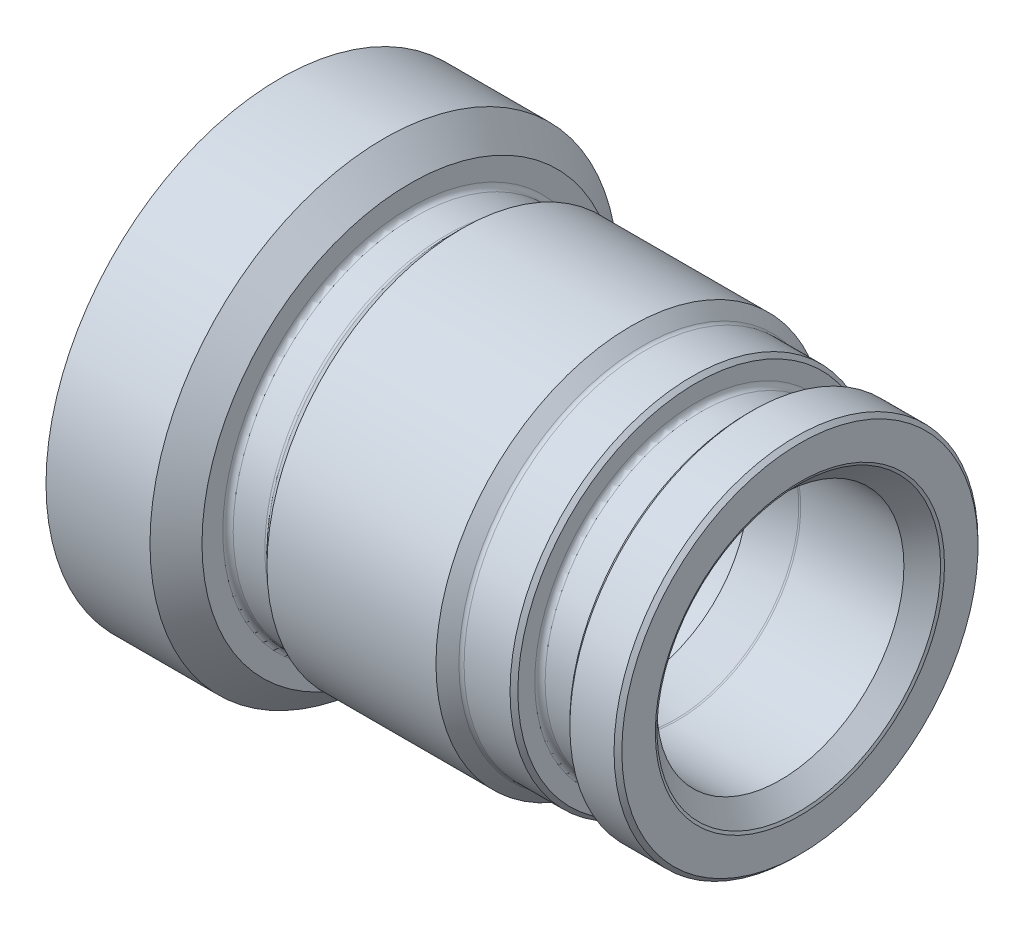
ISO-10303-21;
HEADER;
FILE_DESCRIPTION(('STEP AP214'),'2;1');
FILE_NAME('part.step','',(''),(''),'','','');
FILE_SCHEMA(('AUTOMOTIVE_DESIGN { 1 0 10303 214 1 1 1 1 }'));
ENDSEC;
DATA;
#1=APPLICATION_CONTEXT('core data for automotive mechanical design processes');
#2=APPLICATION_PROTOCOL_DEFINITION('international standard','automotive_design',2000,#1);
#3=PRODUCT_CONTEXT('',#1,'mechanical');
#4=PRODUCT('Part','Part','',(#3));
#5=PRODUCT_RELATED_PRODUCT_CATEGORY('part','',(#4));
#6=PRODUCT_DEFINITION_FORMATION('','',#4);
#7=PRODUCT_DEFINITION_CONTEXT('part definition',#1,'design');
#8=PRODUCT_DEFINITION('design','',#6,#7);
#9=PRODUCT_DEFINITION_SHAPE('','',#8);
#10=(LENGTH_UNIT() NAMED_UNIT(*) SI_UNIT(.MILLI.,.METRE.));
#11=(NAMED_UNIT(*) PLANE_ANGLE_UNIT() SI_UNIT($,.RADIAN.));
#12=(NAMED_UNIT(*) SI_UNIT($,.STERADIAN.) SOLID_ANGLE_UNIT());
#13=UNCERTAINTY_MEASURE_WITH_UNIT(LENGTH_MEASURE(1.E-05),#10,'distance_accuracy_value','');
#14=(GEOMETRIC_REPRESENTATION_CONTEXT(3) GLOBAL_UNCERTAINTY_ASSIGNED_CONTEXT((#13)) GLOBAL_UNIT_ASSIGNED_CONTEXT((#10,
#11,#12)) REPRESENTATION_CONTEXT('',''));
#15=CARTESIAN_POINT('',(0.,0.,0.));
#16=DIRECTION('',(0.,0.,1.));
#17=DIRECTION('',(1.,0.,0.));
#18=AXIS2_PLACEMENT_3D('',#15,#16,#17);
#19=CARTESIAN_POINT('',(-37.5919999999999,0.,0.));
#20=DIRECTION('',(-1.,0.,0.));
#21=DIRECTION('',(0.,0.,1.));
#22=AXIS2_PLACEMENT_3D('',#19,#20,#21);
#23=TOROIDAL_SURFACE('',#22,18.288,0.508000000000002);
#24=CARTESIAN_POINT('',(-37.5919999999999,0.,0.));
#25=DIRECTION('',(-1.,0.,0.));
#26=DIRECTION('',(0.,0.,1.));
#27=AXIS2_PLACEMENT_3D('',#24,#25,#26);
#28=CIRCLE('',#27,17.78);
#29=CARTESIAN_POINT('',(-37.5919999999999,0.,17.78));
#30=VERTEX_POINT('',#29);
#31=EDGE_CURVE('E149',#30,#30,#28,.T.);
#32=ORIENTED_EDGE('',*,*,#31,.T.);
#33=EDGE_LOOP('',(#32));
#34=FACE_BOUND('',#33,.T.);
#35=CARTESIAN_POINT('',(-38.0999999999999,0.,0.));
#36=DIRECTION('',(-1.,0.,0.));
#37=DIRECTION('',(0.,0.,1.));
#38=AXIS2_PLACEMENT_3D('',#35,#36,#37);
#39=CIRCLE('',#38,18.288);
#40=CARTESIAN_POINT('',(-38.0999999999999,0.,18.288));
#41=VERTEX_POINT('',#40);
#42=EDGE_CURVE('E65',#41,#41,#39,.T.);
#43=ORIENTED_EDGE('',*,*,#42,.F.);
#44=EDGE_LOOP('',(#43));
#45=FACE_BOUND('',#44,.T.);
#46=ADVANCED_FACE('F34',(#34,#45),#23,.F.);
#47=CARTESIAN_POINT('',(-38.0999999999999,18.288,0.));
#48=DIRECTION('',(-1.,0.,0.));
#49=DIRECTION('',(0.,0.,1.));
#50=AXIS2_PLACEMENT_3D('',#47,#48,#49);
#51=PLANE('',#50);
#52=CARTESIAN_POINT('',(-38.0999999999999,0.,0.));
#53=DIRECTION('',(-1.,0.,0.));
#54=DIRECTION('',(0.,0.,1.));
#55=AXIS2_PLACEMENT_3D('',#52,#53,#54);
#56=CIRCLE('',#55,20.32);
#57=CARTESIAN_POINT('',(-38.0999999999999,0.,20.32));
#58=VERTEX_POINT('',#57);
#59=EDGE_CURVE('E68',#58,#58,#56,.T.);
#60=ORIENTED_EDGE('',*,*,#59,.F.);
#61=EDGE_LOOP('',(#60));
#62=FACE_BOUND('',#61,.T.);
#63=ORIENTED_EDGE('',*,*,#42,.T.);
#64=EDGE_LOOP('',(#63));
#65=FACE_BOUND('',#64,.T.);
#66=ADVANCED_FACE('F174',(#62,#65),#51,.F.);
#67=CARTESIAN_POINT('',(-38.0999999999999,0.,0.));
#68=DIRECTION('',(-1.,0.,0.));
#69=DIRECTION('',(0.,0.,1.));
#70=AXIS2_PLACEMENT_3D('',#67,#68,#69);
#71=CONICAL_SURFACE('',#70,20.32,0.785398163397449);
#72=CARTESIAN_POINT('',(-40.6399999999999,0.,0.));
#73=DIRECTION('',(-1.,0.,0.));
#74=DIRECTION('',(0.,0.,1.));
#75=AXIS2_PLACEMENT_3D('',#72,#73,#74);
#76=CIRCLE('',#75,22.86);
#77=CARTESIAN_POINT('',(-40.6399999999999,0.,22.86));
#78=VERTEX_POINT('',#77);
#79=EDGE_CURVE('E71',#78,#78,#76,.T.);
#80=ORIENTED_EDGE('',*,*,#79,.F.);
#81=EDGE_LOOP('',(#80));
#82=FACE_BOUND('',#81,.T.);
#83=ORIENTED_EDGE('',*,*,#59,.T.);
#84=EDGE_LOOP('',(#83));
#85=FACE_BOUND('',#84,.T.);
#86=ADVANCED_FACE('F178',(#82,#85),#71,.T.);
#87=CARTESIAN_POINT('',(0.,0.,0.));
#88=DIRECTION('',(-1.,0.,0.));
#89=DIRECTION('',(0.,0.,1.));
#90=AXIS2_PLACEMENT_3D('',#87,#88,#89);
#91=CYLINDRICAL_SURFACE('',#90,22.86);
#92=CARTESIAN_POINT('',(-50.7999999999999,0.,0.));
#93=DIRECTION('',(-1.,0.,0.));
#94=DIRECTION('',(0.,0.,1.));
#95=AXIS2_PLACEMENT_3D('',#92,#93,#94);
#96=CIRCLE('',#95,22.86);
#97=CARTESIAN_POINT('',(-50.7999999999999,0.,22.86));
#98=VERTEX_POINT('',#97);
#99=EDGE_CURVE('E74',#98,#98,#96,.T.);
#100=ORIENTED_EDGE('',*,*,#99,.F.);
#101=EDGE_LOOP('',(#100));
#102=FACE_BOUND('',#101,.T.);
#103=ORIENTED_EDGE('',*,*,#79,.T.);
#104=EDGE_LOOP('',(#103));
#105=FACE_BOUND('',#104,.T.);
#106=ADVANCED_FACE('F183',(#102,#105),#91,.T.);
#107=CARTESIAN_POINT('',(-50.7999999999999,22.86,0.));
#108=DIRECTION('',(1.,0.,0.));
#109=DIRECTION('',(0.,0.,-1.));
#110=AXIS2_PLACEMENT_3D('',#107,#108,#109);
#111=PLANE('',#110);
#112=CARTESIAN_POINT('',(-50.7999999999999,0.,0.));
#113=DIRECTION('',(-1.,0.,0.));
#114=DIRECTION('',(0.,0.,1.));
#115=AXIS2_PLACEMENT_3D('',#112,#113,#114);
#116=CIRCLE('',#115,7.62);
#117=CARTESIAN_POINT('',(-50.7999999999999,0.,7.62));
#118=VERTEX_POINT('',#117);
#119=EDGE_CURVE('E77',#118,#118,#116,.T.);
#120=ORIENTED_EDGE('',*,*,#119,.F.);
#121=EDGE_LOOP('',(#120));
#122=FACE_BOUND('',#121,.T.);
#123=ORIENTED_EDGE('',*,*,#99,.T.);
#124=EDGE_LOOP('',(#123));
#125=FACE_BOUND('',#124,.T.);
#126=ADVANCED_FACE('F191',(#122,#125),#111,.F.);
#127=CARTESIAN_POINT('',(0.,0.,0.));
#128=DIRECTION('',(-1.,0.,0.));
#129=DIRECTION('',(0.,0.,1.));
#130=AXIS2_PLACEMENT_3D('',#127,#128,#129);
#131=CYLINDRICAL_SURFACE('',#130,7.62);
#132=CARTESIAN_POINT('',(-48.2599999999999,0.,0.));
#133=DIRECTION('',(-1.,0.,0.));
#134=DIRECTION('',(0.,0.,1.));
#135=AXIS2_PLACEMENT_3D('',#132,#133,#134);
#136=CIRCLE('',#135,7.62);
#137=CARTESIAN_POINT('',(-48.2599999999999,0.,7.62));
#138=VERTEX_POINT('',#137);
#139=EDGE_CURVE('E80',#138,#138,#136,.T.);
#140=ORIENTED_EDGE('',*,*,#139,.F.);
#141=EDGE_LOOP('',(#140));
#142=FACE_BOUND('',#141,.T.);
#143=ORIENTED_EDGE('',*,*,#119,.T.);
#144=EDGE_LOOP('',(#143));
#145=FACE_BOUND('',#144,.T.);
#146=ADVANCED_FACE('F195',(#142,#145),#131,.F.);
#147=CARTESIAN_POINT('',(-48.2599999999999,7.62,0.));
#148=DIRECTION('',(-1.,0.,0.));
#149=DIRECTION('',(0.,0.,1.));
#150=AXIS2_PLACEMENT_3D('',#147,#148,#149);
#151=PLANE('',#150);
#152=CARTESIAN_POINT('',(-48.2599999999999,0.,0.));
#153=DIRECTION('',(-1.,0.,0.));
#154=DIRECTION('',(0.,0.,1.));
#155=AXIS2_PLACEMENT_3D('',#152,#153,#154);
#156=CIRCLE('',#155,9.65199999999998);
#157=CARTESIAN_POINT('',(-48.2599999999999,0.,9.65199999999998));
#158=VERTEX_POINT('',#157);
#159=EDGE_CURVE('E83',#158,#158,#156,.T.);
#160=ORIENTED_EDGE('',*,*,#159,.F.);
#161=EDGE_LOOP('',(#160));
#162=FACE_BOUND('',#161,.T.);
#163=ORIENTED_EDGE('',*,*,#139,.T.);
#164=EDGE_LOOP('',(#163));
#165=FACE_BOUND('',#164,.T.);
#166=ADVANCED_FACE('F199',(#162,#165),#151,.F.);
#167=CARTESIAN_POINT('',(-47.7519999999999,0.,0.));
#168=DIRECTION('',(-1.,0.,0.));
#169=DIRECTION('',(0.,0.,1.));
#170=AXIS2_PLACEMENT_3D('',#167,#168,#169);
#171=TOROIDAL_SURFACE('',#170,9.65199999999999,0.508000000000001);
#172=ORIENTED_EDGE('',*,*,#159,.T.);
#173=EDGE_LOOP('',(#172));
#174=FACE_BOUND('',#173,.T.);
#175=CARTESIAN_POINT('',(-47.7519999999999,0.,0.));
#176=DIRECTION('',(-1.,0.,0.));
#177=DIRECTION('',(0.,0.,1.));
#178=AXIS2_PLACEMENT_3D('',#175,#176,#177);
#179=CIRCLE('',#178,10.16);
#180=CARTESIAN_POINT('',(-47.7519999999999,0.,10.16));
#181=VERTEX_POINT('',#180);
#182=EDGE_CURVE('E86',#181,#181,#179,.T.);
#183=ORIENTED_EDGE('',*,*,#182,.F.);
#184=EDGE_LOOP('',(#183));
#185=FACE_BOUND('',#184,.T.);
#186=ADVANCED_FACE('F203',(#174,#185),#171,.F.);
#187=CARTESIAN_POINT('',(0.,0.,0.));
#188=DIRECTION('',(-1.,0.,0.));
#189=DIRECTION('',(0.,0.,1.));
#190=AXIS2_PLACEMENT_3D('',#187,#188,#189);
#191=CYLINDRICAL_SURFACE('',#190,10.16);
#192=CARTESIAN_POINT('',(-46.2279999999999,0.,0.));
#193=DIRECTION('',(-1.,0.,0.));
#194=DIRECTION('',(0.,0.,1.));
#195=AXIS2_PLACEMENT_3D('',#192,#193,#194);
#196=CIRCLE('',#195,10.16);
#197=CARTESIAN_POINT('',(-46.2279999999999,0.,10.16));
#198=VERTEX_POINT('',#197);
#199=EDGE_CURVE('E89',#198,#198,#196,.T.);
#200=ORIENTED_EDGE('',*,*,#199,.F.);
#201=EDGE_LOOP('',(#200));
#202=FACE_BOUND('',#201,.T.);
#203=ORIENTED_EDGE('',*,*,#182,.T.);
#204=EDGE_LOOP('',(#203));
#205=FACE_BOUND('',#204,.T.);
#206=ADVANCED_FACE('F207',(#202,#205),#191,.F.);
#207=CARTESIAN_POINT('',(-46.2279999999999,0.,0.));
#208=DIRECTION('',(-1.,0.,0.));
#209=DIRECTION('',(0.,0.,1.));
#210=AXIS2_PLACEMENT_3D('',#207,#208,#209);
#211=TOROIDAL_SURFACE('',#210,9.65199999999999,0.508000000000001);
#212=ORIENTED_EDGE('',*,*,#199,.T.);
#213=EDGE_LOOP('',(#212));
#214=FACE_BOUND('',#213,.T.);
#215=CARTESIAN_POINT('',(-45.7199999999999,0.,0.));
#216=DIRECTION('',(-1.,0.,0.));
#217=DIRECTION('',(0.,0.,1.));
#218=AXIS2_PLACEMENT_3D('',#215,#216,#217);
#219=CIRCLE('',#218,9.65199999999998);
#220=CARTESIAN_POINT('',(-45.7199999999999,0.,9.65199999999998));
#221=VERTEX_POINT('',#220);
#222=EDGE_CURVE('E92',#221,#221,#219,.T.);
#223=ORIENTED_EDGE('',*,*,#222,.F.);
#224=EDGE_LOOP('',(#223));
#225=FACE_BOUND('',#224,.T.);
#226=ADVANCED_FACE('F211',(#214,#225),#211,.F.);
#227=CARTESIAN_POINT('',(-45.7199999999999,9.65199999999998,0.));
#228=DIRECTION('',(1.,0.,0.));
#229=DIRECTION('',(0.,0.,-1.));
#230=AXIS2_PLACEMENT_3D('',#227,#228,#229);
#231=PLANE('',#230);
#232=CARTESIAN_POINT('',(-45.7199999999999,0.,0.));
#233=DIRECTION('',(-1.,0.,0.));
#234=DIRECTION('',(0.,0.,1.));
#235=AXIS2_PLACEMENT_3D('',#232,#233,#234);
#236=CIRCLE('',#235,8.89);
#237=CARTESIAN_POINT('',(-45.7199999999999,0.,8.89));
#238=VERTEX_POINT('',#237);
#239=EDGE_CURVE('E95',#238,#238,#236,.T.);
#240=ORIENTED_EDGE('',*,*,#239,.F.);
#241=EDGE_LOOP('',(#240));
#242=FACE_BOUND('',#241,.T.);
#243=ORIENTED_EDGE('',*,*,#222,.T.);
#244=EDGE_LOOP('',(#243));
#245=FACE_BOUND('',#244,.T.);
#246=ADVANCED_FACE('F215',(#242,#245),#231,.F.);
#247=CARTESIAN_POINT('',(0.,0.,0.));
#248=DIRECTION('',(-1.,0.,0.));
#249=DIRECTION('',(0.,0.,1.));
#250=AXIS2_PLACEMENT_3D('',#247,#248,#249);
#251=CYLINDRICAL_SURFACE('',#250,8.89);
#252=CARTESIAN_POINT('',(-24.13,0.,0.));
#253=DIRECTION('',(-1.,0.,0.));
#254=DIRECTION('',(0.,0.,1.));
#255=AXIS2_PLACEMENT_3D('',#252,#253,#254);
#256=CIRCLE('',#255,8.89);
#257=CARTESIAN_POINT('',(-24.13,0.,8.89));
#258=VERTEX_POINT('',#257);
#259=EDGE_CURVE('E98',#258,#258,#256,.T.);
#260=ORIENTED_EDGE('',*,*,#259,.F.);
#261=EDGE_LOOP('',(#260));
#262=FACE_BOUND('',#261,.T.);
#263=ORIENTED_EDGE('',*,*,#239,.T.);
#264=EDGE_LOOP('',(#263));
#265=FACE_BOUND('',#264,.T.);
#266=ADVANCED_FACE('F219',(#262,#265),#251,.F.);
#267=CARTESIAN_POINT('',(-24.13,0.,0.));
#268=DIRECTION('',(1.,0.,0.));
#269=DIRECTION('',(0.,0.,-1.));
#270=AXIS2_PLACEMENT_3D('',#267,#268,#269);
#271=CONICAL_SURFACE('',#270,8.89,0.643501108793284);
#272=CARTESIAN_POINT('',(-21.7254666666667,0.,0.));
#273=DIRECTION('',(-1.,0.,0.));
#274=DIRECTION('',(0.,0.,1.));
#275=AXIS2_PLACEMENT_3D('',#272,#273,#274);
#276=CIRCLE('',#275,10.6934);
#277=CARTESIAN_POINT('',(-21.7254666666667,0.,10.6934));
#278=VERTEX_POINT('',#277);
#279=EDGE_CURVE('E101',#278,#278,#276,.T.);
#280=ORIENTED_EDGE('',*,*,#279,.F.);
#281=EDGE_LOOP('',(#280));
#282=FACE_BOUND('',#281,.T.);
#283=ORIENTED_EDGE('',*,*,#259,.T.);
#284=EDGE_LOOP('',(#283));
#285=FACE_BOUND('',#284,.T.);
#286=ADVANCED_FACE('F223',(#282,#285),#271,.F.);
#287=CARTESIAN_POINT('',(-21.4206666666667,0.,0.));
#288=DIRECTION('',(-1.,0.,0.));
#289=DIRECTION('',(0.,0.,1.));
#290=AXIS2_PLACEMENT_3D('',#287,#288,#289);
#291=TOROIDAL_SURFACE('',#290,10.287,0.508);
#292=ORIENTED_EDGE('',*,*,#279,.T.);
#293=EDGE_LOOP('',(#292));
#294=FACE_BOUND('',#293,.T.);
#295=CARTESIAN_POINT('',(-21.4206666666667,0.,0.));
#296=DIRECTION('',(-1.,0.,0.));
#297=DIRECTION('',(0.,0.,1.));
#298=AXIS2_PLACEMENT_3D('',#295,#296,#297);
#299=CIRCLE('',#298,10.795);
#300=CARTESIAN_POINT('',(-21.4206666666667,0.,10.795));
#301=VERTEX_POINT('',#300);
#302=EDGE_CURVE('E104',#301,#301,#299,.T.);
#303=ORIENTED_EDGE('',*,*,#302,.F.);
#304=EDGE_LOOP('',(#303));
#305=FACE_BOUND('',#304,.T.);
#306=ADVANCED_FACE('F227',(#294,#305),#291,.F.);
#307=CARTESIAN_POINT('',(0.,0.,0.));
#308=DIRECTION('',(-1.,0.,0.));
#309=DIRECTION('',(0.,0.,1.));
#310=AXIS2_PLACEMENT_3D('',#307,#308,#309);
#311=CYLINDRICAL_SURFACE('',#310,10.795);
#312=CARTESIAN_POINT('',(-15.875,0.,0.));
#313=DIRECTION('',(-1.,0.,0.));
#314=DIRECTION('',(0.,0.,1.));
#315=AXIS2_PLACEMENT_3D('',#312,#313,#314);
#316=CIRCLE('',#315,10.795);
#317=CARTESIAN_POINT('',(-15.875,0.,10.795));
#318=VERTEX_POINT('',#317);
#319=EDGE_CURVE('E107',#318,#318,#316,.T.);
#320=ORIENTED_EDGE('',*,*,#319,.F.);
#321=EDGE_LOOP('',(#320));
#322=FACE_BOUND('',#321,.T.);
#323=ORIENTED_EDGE('',*,*,#302,.T.);
#324=EDGE_LOOP('',(#323));
#325=FACE_BOUND('',#324,.T.);
#326=ADVANCED_FACE('F231',(#322,#325),#311,.F.);
#327=CARTESIAN_POINT('',(-15.875,0.,0.));
#328=DIRECTION('',(1.,0.,0.));
#329=DIRECTION('',(0.,0.,-1.));
#330=AXIS2_PLACEMENT_3D('',#327,#328,#329);
#331=CONICAL_SURFACE('',#330,10.795,0.321750554396643);
#332=CARTESIAN_POINT('',(-12.143206653771,0.,0.));
#333=DIRECTION('',(-1.,0.,0.));
#334=DIRECTION('',(0.,0.,1.));
#335=AXIS2_PLACEMENT_3D('',#332,#333,#334);
#336=CIRCLE('',#335,12.0389311154097);
#337=CARTESIAN_POINT('',(-12.143206653771,0.,12.0389311154097));
#338=VERTEX_POINT('',#337);
#339=EDGE_CURVE('E110',#338,#338,#336,.T.);
#340=ORIENTED_EDGE('',*,*,#339,.F.);
#341=EDGE_LOOP('',(#340));
#342=FACE_BOUND('',#341,.T.);
#343=ORIENTED_EDGE('',*,*,#319,.T.);
#344=EDGE_LOOP('',(#343));
#345=FACE_BOUND('',#344,.T.);
#346=ADVANCED_FACE('F235',(#342,#345),#331,.F.);
#347=CARTESIAN_POINT('',(-11.9825629486345,0.,0.));
#348=DIRECTION('',(-1.,0.,0.));
#349=DIRECTION('',(0.,0.,1.));
#350=AXIS2_PLACEMENT_3D('',#347,#348,#349);
#351=TOROIDAL_SURFACE('',#350,11.557,0.508);
#352=ORIENTED_EDGE('',*,*,#339,.T.);
#353=EDGE_LOOP('',(#352));
#354=FACE_BOUND('',#353,.T.);
#355=CARTESIAN_POINT('',(-11.9825629486345,0.,0.));
#356=DIRECTION('',(-1.,0.,0.));
#357=DIRECTION('',(0.,0.,1.));
#358=AXIS2_PLACEMENT_3D('',#355,#356,#357);
#359=CIRCLE('',#358,12.065);
#360=CARTESIAN_POINT('',(-11.9825629486345,0.,12.065));
#361=VERTEX_POINT('',#360);
#362=EDGE_CURVE('E113',#361,#361,#359,.T.);
#363=ORIENTED_EDGE('',*,*,#362,.F.);
#364=EDGE_LOOP('',(#363));
#365=FACE_BOUND('',#364,.T.);
#366=ADVANCED_FACE('F239',(#354,#365),#351,.F.);
#367=CARTESIAN_POINT('',(0.,0.,0.));
#368=DIRECTION('',(-1.,0.,0.));
#369=DIRECTION('',(0.,0.,1.));
#370=AXIS2_PLACEMENT_3D('',#367,#368,#369);
#371=CYLINDRICAL_SURFACE('',#370,12.065);
#372=CARTESIAN_POINT('',(-1.905,0.,0.));
#373=DIRECTION('',(-1.,0.,0.));
#374=DIRECTION('',(0.,0.,1.));
#375=AXIS2_PLACEMENT_3D('',#372,#373,#374);
#376=CIRCLE('',#375,12.065);
#377=CARTESIAN_POINT('',(-1.905,0.,12.065));
#378=VERTEX_POINT('',#377);
#379=EDGE_CURVE('E116',#378,#378,#376,.T.);
#380=ORIENTED_EDGE('',*,*,#379,.F.);
#381=EDGE_LOOP('',(#380));
#382=FACE_BOUND('',#381,.T.);
#383=ORIENTED_EDGE('',*,*,#362,.T.);
#384=EDGE_LOOP('',(#383));
#385=FACE_BOUND('',#384,.T.);
#386=ADVANCED_FACE('F243',(#382,#385),#371,.F.);
#387=CARTESIAN_POINT('',(0.,0.,0.));
#388=DIRECTION('',(1.,0.,0.));
#389=DIRECTION('',(0.,0.,-1.));
#390=AXIS2_PLACEMENT_3D('',#387,#388,#389);
#391=CONICAL_SURFACE('',#390,13.97,0.785398163397448);
#392=CARTESIAN_POINT('',(-0.111592316367924,0.,0.));
#393=DIRECTION('',(1.,0.,0.));
#394=DIRECTION('',(0.,0.,-1.));
#395=AXIS2_PLACEMENT_3D('',#392,#393,#394);
#396=CIRCLE('',#395,13.8584076836321);
#397=CARTESIAN_POINT('',(-0.111592316367924,0.,-13.8584076836321));
#398=VERTEX_POINT('',#397);
#399=EDGE_CURVE('E44',#398,#398,#396,.T.);
#400=ORIENTED_EDGE('',*,*,#399,.T.);
#401=EDGE_LOOP('',(#400));
#402=FACE_BOUND('',#401,.T.);
#403=ORIENTED_EDGE('',*,*,#379,.T.);
#404=EDGE_LOOP('',(#403));
#405=FACE_BOUND('',#404,.T.);
#406=ADVANCED_FACE('F247',(#402,#405),#391,.F.);
#407=CARTESIAN_POINT('',(0.,13.97,0.));
#408=DIRECTION('',(-1.,0.,0.));
#409=DIRECTION('',(0.,0.,1.));
#410=AXIS2_PLACEMENT_3D('',#407,#408,#409);
#411=PLANE('',#410);
#412=CARTESIAN_POINT('',(0.,0.,0.));
#413=DIRECTION('',(-1.,0.,0.));
#414=DIRECTION('',(0.,0.,1.));
#415=AXIS2_PLACEMENT_3D('',#412,#413,#414);
#416=CIRCLE('',#415,17.399);
#417=CARTESIAN_POINT('',(0.,0.,17.399));
#418=VERTEX_POINT('',#417);
#419=EDGE_CURVE('E53',#418,#418,#416,.F.);
#420=ORIENTED_EDGE('',*,*,#419,.T.);
#421=EDGE_LOOP('',(#420));
#422=FACE_BOUND('',#421,.T.);
#423=CARTESIAN_POINT('',(0.,0.,0.));
#424=DIRECTION('',(-1.,0.,0.));
#425=DIRECTION('',(0.,0.,1.));
#426=AXIS2_PLACEMENT_3D('',#423,#424,#425);
#427=CIRCLE('',#426,14.1278153672642);
#428=CARTESIAN_POINT('',(0.,0.,14.1278153672642));
#429=VERTEX_POINT('',#428);
#430=EDGE_CURVE('E56',#429,#429,#427,.T.);
#431=ORIENTED_EDGE('',*,*,#430,.T.);
#432=EDGE_LOOP('',(#431));
#433=FACE_BOUND('',#432,.T.);
#434=ADVANCED_FACE('F251',(#422,#433),#411,.F.);
#435=CARTESIAN_POINT('',(0.,0.,0.));
#436=DIRECTION('',(-1.,0.,0.));
#437=DIRECTION('',(0.,0.,1.));
#438=AXIS2_PLACEMENT_3D('',#435,#436,#437);
#439=CYLINDRICAL_SURFACE('',#438,17.78);
#440=CARTESIAN_POINT('',(-0.381000000000007,0.,0.));
#441=DIRECTION('',(-1.,0.,0.));
#442=DIRECTION('',(0.,0.,1.));
#443=AXIS2_PLACEMENT_3D('',#440,#441,#442);
#444=CIRCLE('',#443,17.78);
#445=CARTESIAN_POINT('',(-0.381000000000007,0.,17.78));
#446=VERTEX_POINT('',#445);
#447=EDGE_CURVE('E59',#446,#446,#444,.T.);
#448=ORIENTED_EDGE('',*,*,#447,.T.);
#449=EDGE_LOOP('',(#448));
#450=FACE_BOUND('',#449,.T.);
#451=CARTESIAN_POINT('',(-4.69899999999987,0.,0.));
#452=DIRECTION('',(1.,0.,0.));
#453=DIRECTION('',(0.,0.,-1.));
#454=AXIS2_PLACEMENT_3D('',#451,#452,#453);
#455=CIRCLE('',#454,17.78);
#456=CARTESIAN_POINT('',(-4.69899999999987,0.,-17.78));
#457=VERTEX_POINT('',#456);
#458=EDGE_CURVE('E62',#457,#457,#455,.T.);
#459=ORIENTED_EDGE('',*,*,#458,.T.);
#460=EDGE_LOOP('',(#459));
#461=FACE_BOUND('',#460,.T.);
#462=ADVANCED_FACE('F255',(#450,#461),#439,.T.);
#463=CARTESIAN_POINT('',(-5.07999999999988,17.78,0.));
#464=DIRECTION('',(1.,0.,0.));
#465=DIRECTION('',(0.,0.,-1.));
#466=AXIS2_PLACEMENT_3D('',#463,#464,#465);
#467=PLANE('',#466);
#468=CARTESIAN_POINT('',(-5.07999999999988,0.,0.));
#469=DIRECTION('',(1.,0.,0.));
#470=DIRECTION('',(0.,0.,-1.));
#471=AXIS2_PLACEMENT_3D('',#468,#469,#470);
#472=CIRCLE('',#471,17.399);
#473=CARTESIAN_POINT('',(-5.07999999999988,0.,-17.399));
#474=VERTEX_POINT('',#473);
#475=EDGE_CURVE('E48',#474,#474,#472,.F.);
#476=ORIENTED_EDGE('',*,*,#475,.T.);
#477=EDGE_LOOP('',(#476));
#478=FACE_BOUND('',#477,.T.);
#479=CARTESIAN_POINT('',(-5.07999999999988,0.,0.));
#480=DIRECTION('',(-1.,0.,0.));
#481=DIRECTION('',(0.,0.,1.));
#482=AXIS2_PLACEMENT_3D('',#479,#480,#481);
#483=CIRCLE('',#482,15.748);
#484=CARTESIAN_POINT('',(-5.07999999999988,0.,15.748));
#485=VERTEX_POINT('',#484);
#486=EDGE_CURVE('E119',#485,#485,#483,.T.);
#487=ORIENTED_EDGE('',*,*,#486,.F.);
#488=EDGE_LOOP('',(#487));
#489=FACE_BOUND('',#488,.T.);
#490=ADVANCED_FACE('F259',(#478,#489),#467,.F.);
#491=CARTESIAN_POINT('',(-5.58799999999988,0.,0.));
#492=DIRECTION('',(-1.,0.,0.));
#493=DIRECTION('',(0.,0.,1.));
#494=AXIS2_PLACEMENT_3D('',#491,#492,#493);
#495=TOROIDAL_SURFACE('',#494,15.748,0.508);
#496=ORIENTED_EDGE('',*,*,#486,.T.);
#497=EDGE_LOOP('',(#496));
#498=FACE_BOUND('',#497,.T.);
#499=CARTESIAN_POINT('',(-5.58799999999988,0.,0.));
#500=DIRECTION('',(-1.,0.,0.));
#501=DIRECTION('',(0.,0.,1.));
#502=AXIS2_PLACEMENT_3D('',#499,#500,#501);
#503=CIRCLE('',#502,15.24);
#504=CARTESIAN_POINT('',(-5.58799999999988,0.,15.24));
#505=VERTEX_POINT('',#504);
#506=EDGE_CURVE('E122',#505,#505,#503,.T.);
#507=ORIENTED_EDGE('',*,*,#506,.F.);
#508=EDGE_LOOP('',(#507));
#509=FACE_BOUND('',#508,.T.);
#510=ADVANCED_FACE('F263',(#498,#509),#495,.F.);
#511=CARTESIAN_POINT('',(0.,0.,0.));
#512=DIRECTION('',(-1.,0.,0.));
#513=DIRECTION('',(0.,0.,1.));
#514=AXIS2_PLACEMENT_3D('',#511,#512,#513);
#515=CYLINDRICAL_SURFACE('',#514,15.24);
#516=CARTESIAN_POINT('',(-9.65199999999998,0.,0.));
#517=DIRECTION('',(-1.,0.,0.));
#518=DIRECTION('',(0.,0.,1.));
#519=AXIS2_PLACEMENT_3D('',#516,#517,#518);
#520=CIRCLE('',#519,15.24);
#521=CARTESIAN_POINT('',(-9.65199999999998,0.,15.24));
#522=VERTEX_POINT('',#521);
#523=EDGE_CURVE('E125',#522,#522,#520,.T.);
#524=ORIENTED_EDGE('',*,*,#523,.F.);
#525=EDGE_LOOP('',(#524));
#526=FACE_BOUND('',#525,.T.);
#527=ORIENTED_EDGE('',*,*,#506,.T.);
#528=EDGE_LOOP('',(#527));
#529=FACE_BOUND('',#528,.T.);
#530=ADVANCED_FACE('F267',(#526,#529),#515,.T.);
#531=CARTESIAN_POINT('',(-9.65199999999998,0.,0.));
#532=DIRECTION('',(-1.,0.,0.));
#533=DIRECTION('',(0.,0.,1.));
#534=AXIS2_PLACEMENT_3D('',#531,#532,#533);
#535=TOROIDAL_SURFACE('',#534,15.748,0.508);
#536=ORIENTED_EDGE('',*,*,#523,.T.);
#537=EDGE_LOOP('',(#536));
#538=FACE_BOUND('',#537,.T.);
#539=CARTESIAN_POINT('',(-10.16,0.,0.));
#540=DIRECTION('',(-1.,0.,0.));
#541=DIRECTION('',(0.,0.,1.));
#542=AXIS2_PLACEMENT_3D('',#539,#540,#541);
#543=CIRCLE('',#542,15.748);
#544=CARTESIAN_POINT('',(-10.16,0.,15.748));
#545=VERTEX_POINT('',#544);
#546=EDGE_CURVE('E128',#545,#545,#543,.T.);
#547=ORIENTED_EDGE('',*,*,#546,.F.);
#548=EDGE_LOOP('',(#547));
#549=FACE_BOUND('',#548,.T.);
#550=ADVANCED_FACE('F271',(#538,#549),#535,.F.);
#551=CARTESIAN_POINT('',(-10.16,15.748,0.));
#552=DIRECTION('',(-1.,0.,0.));
#553=DIRECTION('',(0.,0.,1.));
#554=AXIS2_PLACEMENT_3D('',#551,#552,#553);
#555=PLANE('',#554);
#556=CARTESIAN_POINT('',(-10.16,0.,0.));
#557=DIRECTION('',(-1.,0.,0.));
#558=DIRECTION('',(0.,0.,1.));
#559=AXIS2_PLACEMENT_3D('',#556,#557,#558);
#560=CIRCLE('',#559,17.399);
#561=CARTESIAN_POINT('',(-10.16,0.,17.399));
#562=VERTEX_POINT('',#561);
#563=EDGE_CURVE('E10',#562,#562,#560,.F.);
#564=ORIENTED_EDGE('',*,*,#563,.T.);
#565=EDGE_LOOP('',(#564));
#566=FACE_BOUND('',#565,.T.);
#567=ORIENTED_EDGE('',*,*,#546,.T.);
#568=EDGE_LOOP('',(#567));
#569=FACE_BOUND('',#568,.T.);
#570=ADVANCED_FACE('F275',(#566,#569),#555,.F.);
#571=CARTESIAN_POINT('',(0.,0.,0.));
#572=DIRECTION('',(-1.,0.,0.));
#573=DIRECTION('',(0.,0.,1.));
#574=AXIS2_PLACEMENT_3D('',#571,#572,#573);
#575=CYLINDRICAL_SURFACE('',#574,17.78);
#576=CARTESIAN_POINT('',(-10.541,0.,0.));
#577=DIRECTION('',(-1.,0.,0.));
#578=DIRECTION('',(0.,0.,1.));
#579=AXIS2_PLACEMENT_3D('',#576,#577,#578);
#580=CIRCLE('',#579,17.78);
#581=CARTESIAN_POINT('',(-10.541,0.,17.78));
#582=VERTEX_POINT('',#581);
#583=EDGE_CURVE('E40',#582,#582,#580,.T.);
#584=ORIENTED_EDGE('',*,*,#583,.T.);
#585=EDGE_LOOP('',(#584));
#586=FACE_BOUND('',#585,.T.);
#587=CARTESIAN_POINT('',(-15.0295795103144,0.,0.));
#588=DIRECTION('',(-1.,0.,0.));
#589=DIRECTION('',(0.,0.,1.));
#590=AXIS2_PLACEMENT_3D('',#587,#588,#589);
#591=CIRCLE('',#590,17.78);
#592=CARTESIAN_POINT('',(-15.0295795103144,0.,17.78));
#593=VERTEX_POINT('',#592);
#594=EDGE_CURVE('E131',#593,#593,#591,.T.);
#595=ORIENTED_EDGE('',*,*,#594,.F.);
#596=EDGE_LOOP('',(#595));
#597=FACE_BOUND('',#596,.T.);
#598=ADVANCED_FACE('F279',(#586,#597),#575,.T.);
#599=CARTESIAN_POINT('',(-15.0295795103144,0.,0.));
#600=DIRECTION('',(-1.,0.,0.));
#601=DIRECTION('',(0.,0.,1.));
#602=AXIS2_PLACEMENT_3D('',#599,#600,#601);
#603=TOROIDAL_SURFACE('',#602,18.288,0.508000000000002);
#604=ORIENTED_EDGE('',*,*,#594,.T.);
#605=EDGE_LOOP('',(#604));
#606=FACE_BOUND('',#605,.T.);
#607=CARTESIAN_POINT('',(-15.3887897551572,0.,0.));
#608=DIRECTION('',(-1.,0.,0.));
#609=DIRECTION('',(0.,0.,1.));
#610=AXIS2_PLACEMENT_3D('',#607,#608,#609);
#611=CIRCLE('',#610,17.9287897551572);
#612=CARTESIAN_POINT('',(-15.3887897551572,0.,17.9287897551572));
#613=VERTEX_POINT('',#612);
#614=EDGE_CURVE('E134',#613,#613,#611,.T.);
#615=ORIENTED_EDGE('',*,*,#614,.F.);
#616=EDGE_LOOP('',(#615));
#617=FACE_BOUND('',#616,.T.);
#618=ADVANCED_FACE('F282',(#606,#617),#603,.F.);
#619=CARTESIAN_POINT('',(-15.3887897551572,0.,0.));
#620=DIRECTION('',(-1.,0.,0.));
#621=DIRECTION('',(0.,0.,1.));
#622=AXIS2_PLACEMENT_3D('',#619,#620,#621);
#623=CONICAL_SURFACE('',#622,17.9287897551572,0.785398163397449);
#624=CARTESIAN_POINT('',(-16.5099999999999,0.,0.));
#625=DIRECTION('',(-1.,0.,0.));
#626=DIRECTION('',(0.,0.,1.));
#627=AXIS2_PLACEMENT_3D('',#624,#625,#626);
#628=CIRCLE('',#627,19.0499999999999);
#629=CARTESIAN_POINT('',(-16.5099999999999,0.,19.0499999999999));
#630=VERTEX_POINT('',#629);
#631=EDGE_CURVE('E137',#630,#630,#628,.T.);
#632=ORIENTED_EDGE('',*,*,#631,.F.);
#633=EDGE_LOOP('',(#632));
#634=FACE_BOUND('',#633,.T.);
#635=ORIENTED_EDGE('',*,*,#614,.T.);
#636=EDGE_LOOP('',(#635));
#637=FACE_BOUND('',#636,.T.);
#638=ADVANCED_FACE('F285',(#634,#637),#623,.T.);
#639=CARTESIAN_POINT('',(0.,0.,0.));
#640=DIRECTION('',(-1.,0.,0.));
#641=DIRECTION('',(0.,0.,1.));
#642=AXIS2_PLACEMENT_3D('',#639,#640,#641);
#643=CYLINDRICAL_SURFACE('',#642,19.0499999999999);
#644=CARTESIAN_POINT('',(-33.0200000000001,0.,0.));
#645=DIRECTION('',(-1.,0.,0.));
#646=DIRECTION('',(0.,0.,1.));
#647=AXIS2_PLACEMENT_3D('',#644,#645,#646);
#648=CIRCLE('',#647,19.0499999999999);
#649=CARTESIAN_POINT('',(-33.0200000000001,0.,19.0499999999999));
#650=VERTEX_POINT('',#649);
#651=EDGE_CURVE('E140',#650,#650,#648,.T.);
#652=ORIENTED_EDGE('',*,*,#651,.F.);
#653=EDGE_LOOP('',(#652));
#654=FACE_BOUND('',#653,.T.);
#655=ORIENTED_EDGE('',*,*,#631,.T.);
#656=EDGE_LOOP('',(#655));
#657=FACE_BOUND('',#656,.T.);
#658=ADVANCED_FACE('F170',(#654,#657),#643,.T.);
#659=CARTESIAN_POINT('',(-33.0200000000001,0.,0.));
#660=DIRECTION('',(1.,0.,0.));
#661=DIRECTION('',(0.,0.,-1.));
#662=AXIS2_PLACEMENT_3D('',#659,#660,#661);
#663=CONICAL_SURFACE('',#662,19.0499999999999,0.785398163397454);
#664=CARTESIAN_POINT('',(-34.1412102448428,0.,0.));
#665=DIRECTION('',(-1.,0.,0.));
#666=DIRECTION('',(0.,0.,1.));
#667=AXIS2_PLACEMENT_3D('',#664,#665,#666);
#668=CIRCLE('',#667,17.9287897551572);
#669=CARTESIAN_POINT('',(-34.1412102448428,0.,17.9287897551572));
#670=VERTEX_POINT('',#669);
#671=EDGE_CURVE('E143',#670,#670,#668,.T.);
#672=ORIENTED_EDGE('',*,*,#671,.F.);
#673=EDGE_LOOP('',(#672));
#674=FACE_BOUND('',#673,.T.);
#675=ORIENTED_EDGE('',*,*,#651,.T.);
#676=EDGE_LOOP('',(#675));
#677=FACE_BOUND('',#676,.T.);
#678=ADVANCED_FACE('F164',(#674,#677),#663,.T.);
#679=CARTESIAN_POINT('',(-34.5004204896855,0.,0.));
#680=DIRECTION('',(-1.,0.,0.));
#681=DIRECTION('',(0.,0.,1.));
#682=AXIS2_PLACEMENT_3D('',#679,#680,#681);
#683=TOROIDAL_SURFACE('',#682,18.288,0.508000000000002);
#684=ORIENTED_EDGE('',*,*,#671,.T.);
#685=EDGE_LOOP('',(#684));
#686=FACE_BOUND('',#685,.T.);
#687=CARTESIAN_POINT('',(-34.5004204896856,0.,0.));
#688=DIRECTION('',(-1.,0.,0.));
#689=DIRECTION('',(0.,0.,1.));
#690=AXIS2_PLACEMENT_3D('',#687,#688,#689);
#691=CIRCLE('',#690,17.78);
#692=CARTESIAN_POINT('',(-34.5004204896856,0.,17.78));
#693=VERTEX_POINT('',#692);
#694=EDGE_CURVE('E146',#693,#693,#691,.T.);
#695=ORIENTED_EDGE('',*,*,#694,.F.);
#696=EDGE_LOOP('',(#695));
#697=FACE_BOUND('',#696,.T.);
#698=ADVANCED_FACE('F159',(#686,#697),#683,.F.);
#699=CARTESIAN_POINT('',(0.,0.,0.));
#700=DIRECTION('',(-1.,0.,0.));
#701=DIRECTION('',(0.,0.,1.));
#702=AXIS2_PLACEMENT_3D('',#699,#700,#701);
#703=CYLINDRICAL_SURFACE('',#702,17.78);
#704=ORIENTED_EDGE('',*,*,#31,.F.);
#705=EDGE_LOOP('',(#704));
#706=FACE_BOUND('',#705,.T.);
#707=ORIENTED_EDGE('',*,*,#694,.T.);
#708=EDGE_LOOP('',(#707));
#709=FACE_BOUND('',#708,.T.);
#710=ADVANCED_FACE('F155',(#706,#709),#703,.T.);
#711=CARTESIAN_POINT('',(-0.381000000000007,0.,0.));
#712=DIRECTION('',(-1.,0.,0.));
#713=DIRECTION('',(0.,0.,1.));
#714=AXIS2_PLACEMENT_3D('',#711,#712,#713);
#715=CONICAL_SURFACE('',#714,17.78,0.785398163397443);
#716=CARTESIAN_POINT('',(0.,0.,17.399));
#717=CARTESIAN_POINT('',(-0.00396875000000083,0.,17.40296875));
#718=CARTESIAN_POINT('',(-0.00793750000000063,0.,17.4069375));
#719=CARTESIAN_POINT('',(-0.0158750000000002,0.,17.414875));
#720=CARTESIAN_POINT('',(-0.01984375,0.,17.41884375));
#721=CARTESIAN_POINT('',(-0.0277812500000001,0.,17.42678125));
#722=CARTESIAN_POINT('',(-0.0317500000000003,0.,17.43075));
#723=CARTESIAN_POINT('',(-0.0396875000000008,0.,17.4386875));
#724=CARTESIAN_POINT('',(-0.0436562500000011,0.,17.44265625));
#725=CARTESIAN_POINT('',(-0.051593750000001,0.,17.45059375));
#726=CARTESIAN_POINT('',(-0.0555625000000007,0.,17.4545625));
#727=CARTESIAN_POINT('',(-0.0635000000000007,0.,17.4625));
#728=CARTESIAN_POINT('',(-0.067468750000001,0.,17.46646875));
#729=CARTESIAN_POINT('',(-0.0754062500000015,0.,17.47440625));
#730=CARTESIAN_POINT('',(-0.0793750000000018,0.,17.478375));
#731=CARTESIAN_POINT('',(-0.0873125000000017,0.,17.4863125));
#732=CARTESIAN_POINT('',(-0.0912812500000014,0.,17.49028125));
#733=CARTESIAN_POINT('',(-0.0992187500000013,0.,17.49821875));
#734=CARTESIAN_POINT('',(-0.103187500000002,0.,17.5021875));
#735=CARTESIAN_POINT('',(-0.111125000000002,0.,17.510125));
#736=CARTESIAN_POINT('',(-0.115093750000002,0.,17.51409375));
#737=CARTESIAN_POINT('',(-0.123031250000002,0.,17.52203125));
#738=CARTESIAN_POINT('',(-0.127000000000002,0.,17.526));
#739=CARTESIAN_POINT('',(-0.134937500000002,0.,17.5339375));
#740=CARTESIAN_POINT('',(-0.138906250000002,0.,17.53790625));
#741=CARTESIAN_POINT('',(-0.146843750000003,0.,17.54584375));
#742=CARTESIAN_POINT('',(-0.150812500000003,0.,17.5498125));
#743=CARTESIAN_POINT('',(-0.158750000000003,0.,17.55775));
#744=CARTESIAN_POINT('',(-0.162718750000003,0.,17.56171875));
#745=CARTESIAN_POINT('',(-0.170656250000003,0.,17.56965625));
#746=CARTESIAN_POINT('',(-0.174625000000003,0.,17.573625));
#747=CARTESIAN_POINT('',(-0.182562500000003,0.,17.5815625));
#748=CARTESIAN_POINT('',(-0.186531250000004,0.,17.58553125));
#749=CARTESIAN_POINT('',(-0.194468750000004,0.,17.59346875));
#750=CARTESIAN_POINT('',(-0.198437500000003,0.,17.5974375));
#751=CARTESIAN_POINT('',(-0.206375000000003,0.,17.605375));
#752=CARTESIAN_POINT('',(-0.210343750000004,0.,17.60934375));
#753=CARTESIAN_POINT('',(-0.218281250000004,0.,17.61728125));
#754=CARTESIAN_POINT('',(-0.222250000000004,0.,17.62125));
#755=CARTESIAN_POINT('',(-0.230187500000004,0.,17.6291875));
#756=CARTESIAN_POINT('',(-0.234156250000004,0.,17.63315625));
#757=CARTESIAN_POINT('',(-0.242093750000004,0.,17.64109375));
#758=CARTESIAN_POINT('',(-0.246062500000005,0.,17.6450625));
#759=CARTESIAN_POINT('',(-0.254000000000005,0.,17.653));
#760=CARTESIAN_POINT('',(-0.257968750000004,0.,17.65696875));
#761=CARTESIAN_POINT('',(-0.265906250000004,0.,17.66490625));
#762=CARTESIAN_POINT('',(-0.269875000000004,0.,17.668875));
#763=CARTESIAN_POINT('',(-0.277812500000005,0.,17.6768125));
#764=CARTESIAN_POINT('',(-0.281781250000005,0.,17.68078125));
#765=CARTESIAN_POINT('',(-0.289718750000005,0.,17.68871875));
#766=CARTESIAN_POINT('',(-0.293687500000005,0.,17.6926875));
#767=CARTESIAN_POINT('',(-0.301625000000005,0.,17.700625));
#768=CARTESIAN_POINT('',(-0.305593750000005,0.,17.70459375));
#769=CARTESIAN_POINT('',(-0.313531250000006,0.,17.71253125));
#770=CARTESIAN_POINT('',(-0.317500000000006,0.,17.7165));
#771=CARTESIAN_POINT('',(-0.325437500000006,0.,17.7244375));
#772=CARTESIAN_POINT('',(-0.329406250000006,0.,17.72840625));
#773=CARTESIAN_POINT('',(-0.337343750000005,0.,17.73634375));
#774=CARTESIAN_POINT('',(-0.341312500000006,0.,17.7403125));
#775=CARTESIAN_POINT('',(-0.349250000000006,0.,17.74825));
#776=CARTESIAN_POINT('',(-0.353218750000007,0.,17.75221875));
#777=CARTESIAN_POINT('',(-0.361156250000007,0.,17.76015625));
#778=CARTESIAN_POINT('',(-0.365125000000006,0.,17.764125));
#779=CARTESIAN_POINT('',(-0.373062500000006,0.,17.7720625));
#780=CARTESIAN_POINT('',(-0.377031250000006,0.,17.77603125));
#781=CARTESIAN_POINT('',(-0.381000000000007,0.,17.78));
#782=B_SPLINE_CURVE_WITH_KNOTS('',3,(#716,#717,#718,#719,#720,#721,#722,#723,#724,#725,#726,
#727,#728,#729,#730,#731,#732,#733,#734,#735,#736,#737,#738,#739,#740,#741,#742,#743,#744,#745,
#746,#747,#748,#749,#750,#751,#752,#753,#754,#755,#756,#757,#758,#759,#760,#761,#762,#763,#764,
#765,#766,#767,#768,#769,#770,#771,#772,#773,#774,#775,#776,#777,#778,#779,#780,#781),
.UNSPECIFIED.,.F.,.F.,(4,2,2,2,2,2,2,2,2,2,2,2,2,2,2,2,2,2,2,2,2,2,2,2,2,2,2,2,2,2,2,2,4),(0.,
0.016837980227004,0.0336759604540105,0.0505139406810146,0.0673519209080186,0.0841899011350251,
0.101027881362029,0.117865861589033,0.13470384181604,0.151541822043044,0.168379802270048,
0.185217782497054,0.202055762724058,0.218893742951062,0.235731723178069,0.252569703405073,
0.269407683632077,0.286245663859083,0.303083644086087,0.319921624313094,0.336759604540098,
0.353597584767102,0.370435564994108,0.387273545221112,0.404111525448116,0.420949505675123,
0.437787485902127,0.454625466129131,0.471463446356137,0.488301426583141,0.505139406810145,
0.521977387037152,0.538815367264156),.UNSPECIFIED.);
#783=EDGE_CURVE('BSEAM158',#418,#446,#782,.T.);
#784=ORIENTED_EDGE('',*,*,#419,.F.);
#785=ORIENTED_EDGE('',*,*,#447,.F.);
#786=ORIENTED_EDGE('',*,*,#783,.T.);
#787=ORIENTED_EDGE('',*,*,#783,.F.);
#788=EDGE_LOOP('',(#784,#786,#785,#787));
#789=FACE_BOUND('',#788,.T.);
#790=ADVANCED_FACE('F158',(#789),#715,.T.);
#791=CARTESIAN_POINT('',(-5.07999999999988,0.,0.));
#792=DIRECTION('',(1.,0.,0.));
#793=DIRECTION('',(0.,0.,-1.));
#794=AXIS2_PLACEMENT_3D('',#791,#792,#793);
#795=CONICAL_SURFACE('',#794,17.399,0.785398163397453);
#796=ORIENTED_EDGE('',*,*,#458,.F.);
#797=EDGE_LOOP('',(#796));
#798=FACE_BOUND('',#797,.T.);
#799=ORIENTED_EDGE('',*,*,#475,.F.);
#800=EDGE_LOOP('',(#799));
#801=FACE_BOUND('',#800,.T.);
#802=ADVANCED_FACE('F326',(#798,#801),#795,.T.);
#803=CARTESIAN_POINT('',(0.,0.,0.));
#804=DIRECTION('',(1.,0.,0.));
#805=DIRECTION('',(0.,0.,-1.));
#806=AXIS2_PLACEMENT_3D('',#803,#804,#805);
#807=CONICAL_SURFACE('',#806,14.1278153672642,1.17809724509618);
#808=ORIENTED_EDGE('',*,*,#399,.F.);
#809=EDGE_LOOP('',(#808));
#810=FACE_BOUND('',#809,.T.);
#811=ORIENTED_EDGE('',*,*,#430,.F.);
#812=EDGE_LOOP('',(#811));
#813=FACE_BOUND('',#812,.T.);
#814=ADVANCED_FACE('F336',(#810,#813),#807,.F.);
#815=CARTESIAN_POINT('',(-10.541,0.,0.));
#816=DIRECTION('',(-1.,0.,0.));
#817=DIRECTION('',(0.,0.,1.));
#818=AXIS2_PLACEMENT_3D('',#815,#816,#817);
#819=CONICAL_SURFACE('',#818,17.78,0.785398163397444);
#820=CARTESIAN_POINT('',(-10.16,0.,17.399));
#821=CARTESIAN_POINT('',(-10.16396875,0.,17.40296875));
#822=CARTESIAN_POINT('',(-10.1679375,0.,17.4069375));
#823=CARTESIAN_POINT('',(-10.175875,0.,17.414875));
#824=CARTESIAN_POINT('',(-10.17984375,0.,17.41884375));
#825=CARTESIAN_POINT('',(-10.18778125,0.,17.42678125));
#826=CARTESIAN_POINT('',(-10.19175,0.,17.43075));
#827=CARTESIAN_POINT('',(-10.1996875,0.,17.4386875));
#828=CARTESIAN_POINT('',(-10.20365625,0.,17.44265625));
#829=CARTESIAN_POINT('',(-10.21159375,0.,17.45059375));
#830=CARTESIAN_POINT('',(-10.2155625,0.,17.4545625));
#831=CARTESIAN_POINT('',(-10.2235,0.,17.4625));
#832=CARTESIAN_POINT('',(-10.22746875,0.,17.46646875));
#833=CARTESIAN_POINT('',(-10.23540625,0.,17.47440625));
#834=CARTESIAN_POINT('',(-10.239375,0.,17.478375));
#835=CARTESIAN_POINT('',(-10.2473125,0.,17.4863125));
#836=CARTESIAN_POINT('',(-10.25128125,0.,17.49028125));
#837=CARTESIAN_POINT('',(-10.25921875,0.,17.49821875));
#838=CARTESIAN_POINT('',(-10.2631875,0.,17.5021875));
#839=CARTESIAN_POINT('',(-10.271125,0.,17.510125));
#840=CARTESIAN_POINT('',(-10.27509375,0.,17.51409375));
#841=CARTESIAN_POINT('',(-10.28303125,0.,17.52203125));
#842=CARTESIAN_POINT('',(-10.287,0.,17.526));
#843=CARTESIAN_POINT('',(-10.2949375,0.,17.5339375));
#844=CARTESIAN_POINT('',(-10.29890625,0.,17.53790625));
#845=CARTESIAN_POINT('',(-10.30684375,0.,17.54584375));
#846=CARTESIAN_POINT('',(-10.3108125,0.,17.5498125));
#847=CARTESIAN_POINT('',(-10.31875,0.,17.55775));
#848=CARTESIAN_POINT('',(-10.32271875,0.,17.56171875));
#849=CARTESIAN_POINT('',(-10.33065625,0.,17.56965625));
#850=CARTESIAN_POINT('',(-10.334625,0.,17.573625));
#851=CARTESIAN_POINT('',(-10.3425625,0.,17.5815625));
#852=CARTESIAN_POINT('',(-10.34653125,0.,17.58553125));
#853=CARTESIAN_POINT('',(-10.35446875,0.,17.59346875));
#854=CARTESIAN_POINT('',(-10.3584375,0.,17.5974375));
#855=CARTESIAN_POINT('',(-10.366375,0.,17.605375));
#856=CARTESIAN_POINT('',(-10.37034375,0.,17.60934375));
#857=CARTESIAN_POINT('',(-10.37828125,0.,17.61728125));
#858=CARTESIAN_POINT('',(-10.38225,0.,17.62125));
#859=CARTESIAN_POINT('',(-10.3901875,0.,17.6291875));
#860=CARTESIAN_POINT('',(-10.39415625,0.,17.63315625));
#861=CARTESIAN_POINT('',(-10.40209375,0.,17.64109375));
#862=CARTESIAN_POINT('',(-10.4060625,0.,17.6450625));
#863=CARTESIAN_POINT('',(-10.414,0.,17.653));
#864=CARTESIAN_POINT('',(-10.41796875,0.,17.65696875));
#865=CARTESIAN_POINT('',(-10.42590625,0.,17.66490625));
#866=CARTESIAN_POINT('',(-10.429875,0.,17.668875));
#867=CARTESIAN_POINT('',(-10.4378125,0.,17.6768125));
#868=CARTESIAN_POINT('',(-10.44178125,0.,17.68078125));
#869=CARTESIAN_POINT('',(-10.44971875,0.,17.68871875));
#870=CARTESIAN_POINT('',(-10.4536875,0.,17.6926875));
#871=CARTESIAN_POINT('',(-10.461625,0.,17.700625));
#872=CARTESIAN_POINT('',(-10.46559375,0.,17.70459375));
#873=CARTESIAN_POINT('',(-10.47353125,0.,17.71253125));
#874=CARTESIAN_POINT('',(-10.4775,0.,17.7165));
#875=CARTESIAN_POINT('',(-10.4854375,0.,17.7244375));
#876=CARTESIAN_POINT('',(-10.48940625,0.,17.72840625));
#877=CARTESIAN_POINT('',(-10.49734375,0.,17.73634375));
#878=CARTESIAN_POINT('',(-10.5013125,0.,17.7403125));
#879=CARTESIAN_POINT('',(-10.50925,0.,17.74825));
#880=CARTESIAN_POINT('',(-10.51321875,0.,17.75221875));
#881=CARTESIAN_POINT('',(-10.52115625,0.,17.76015625));
#882=CARTESIAN_POINT('',(-10.525125,0.,17.764125));
#883=CARTESIAN_POINT('',(-10.5330625,0.,17.7720625));
#884=CARTESIAN_POINT('',(-10.53703125,0.,17.77603125));
#885=CARTESIAN_POINT('',(-10.541,0.,17.78));
#886=B_SPLINE_CURVE_WITH_KNOTS('',3,(#820,#821,#822,#823,#824,#825,#826,#827,#828,#829,#830,
#831,#832,#833,#834,#835,#836,#837,#838,#839,#840,#841,#842,#843,#844,#845,#846,#847,#848,#849,
#850,#851,#852,#853,#854,#855,#856,#857,#858,#859,#860,#861,#862,#863,#864,#865,#866,#867,#868,
#869,#870,#871,#872,#873,#874,#875,#876,#877,#878,#879,#880,#881,#882,#883,#884,#885),
.UNSPECIFIED.,.F.,.F.,(4,2,2,2,2,2,2,2,2,2,2,2,2,2,2,2,2,2,2,2,2,2,2,2,2,2,2,2,2,2,2,2,4),(0.,
0.0168379802270043,0.0336759604540087,0.0505139406810154,0.0673519209080185,0.0841899011350229,
0.10102788136203,0.117865861589034,0.134703841816037,0.151541822043044,0.168379802270048,
0.185217782497055,0.202055762724058,0.218893742951062,0.235731723178069,0.252569703405074,
0.269407683632077,0.286245663859083,0.303083644086088,0.319921624313092,0.336759604540098,
0.353597584767102,0.370435564994106,0.387273545221113,0.404111525448117,0.420949505675121,
0.437787485902127,0.454625466129132,0.471463446356136,0.488301426583142,0.505139406810146,
0.52197738703715,0.538815367264157),.UNSPECIFIED.);
#887=EDGE_CURVE('BSEAM346',#562,#582,#886,.T.);
#888=ORIENTED_EDGE('',*,*,#563,.F.);
#889=ORIENTED_EDGE('',*,*,#583,.F.);
#890=ORIENTED_EDGE('',*,*,#887,.T.);
#891=ORIENTED_EDGE('',*,*,#887,.F.);
#892=EDGE_LOOP('',(#888,#890,#889,#891));
#893=FACE_BOUND('',#892,.T.);
#894=ADVANCED_FACE('F346',(#893),#819,.T.);
#895=CLOSED_SHELL('',(#46,#66,#86,#106,#126,#146,#166,#186,#206,#226,#246,#266,#286,#306,#326,
#346,#366,#386,#406,#434,#462,#490,#510,#530,#550,#570,#598,#618,#638,#658,#678,#698,#710,#790,
#802,#814,#894));
#896=MANIFOLD_SOLID_BREP('B2',#895);
#897=ADVANCED_BREP_SHAPE_REPRESENTATION('',(#18,#896),#14);
#898=SHAPE_DEFINITION_REPRESENTATION(#9,#897);
ENDSEC;
END-ISO-10303-21;
